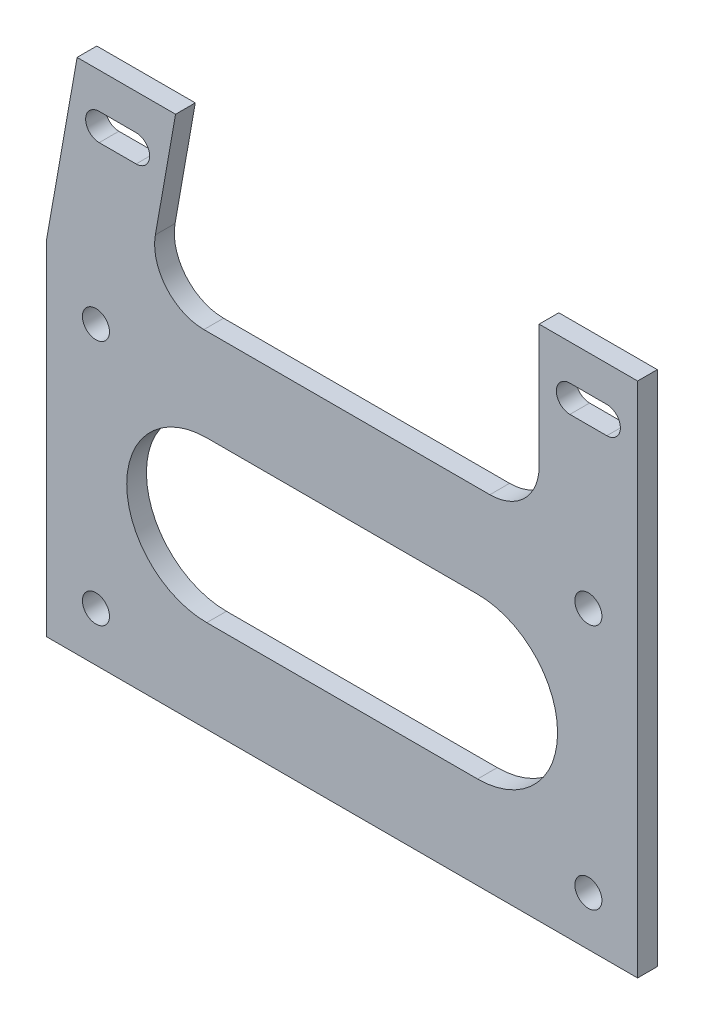
ISO-10303-21;
HEADER;
FILE_DESCRIPTION(('STEP AP214'),'2;1');
FILE_NAME('part.step','',(''),(''),'','','');
FILE_SCHEMA(('AUTOMOTIVE_DESIGN { 1 0 10303 214 1 1 1 1 }'));
ENDSEC;
DATA;
#1=APPLICATION_CONTEXT('core data for automotive mechanical design processes');
#2=APPLICATION_PROTOCOL_DEFINITION('international standard','automotive_design',2000,#1);
#3=PRODUCT_CONTEXT('',#1,'mechanical');
#4=PRODUCT('Part','Part','',(#3));
#5=PRODUCT_RELATED_PRODUCT_CATEGORY('part','',(#4));
#6=PRODUCT_DEFINITION_FORMATION('','',#4);
#7=PRODUCT_DEFINITION_CONTEXT('part definition',#1,'design');
#8=PRODUCT_DEFINITION('design','',#6,#7);
#9=PRODUCT_DEFINITION_SHAPE('','',#8);
#10=(LENGTH_UNIT() NAMED_UNIT(*) SI_UNIT(.MILLI.,.METRE.));
#11=(NAMED_UNIT(*) PLANE_ANGLE_UNIT() SI_UNIT($,.RADIAN.));
#12=(NAMED_UNIT(*) SI_UNIT($,.STERADIAN.) SOLID_ANGLE_UNIT());
#13=UNCERTAINTY_MEASURE_WITH_UNIT(LENGTH_MEASURE(1.E-05),#10,'distance_accuracy_value','');
#14=(GEOMETRIC_REPRESENTATION_CONTEXT(3) GLOBAL_UNCERTAINTY_ASSIGNED_CONTEXT((#13)) GLOBAL_UNIT_ASSIGNED_CONTEXT((#10,
#11,#12)) REPRESENTATION_CONTEXT('',''));
#15=CARTESIAN_POINT('',(0.,0.,0.));
#16=DIRECTION('',(0.,0.,1.));
#17=DIRECTION('',(1.,0.,0.));
#18=AXIS2_PLACEMENT_3D('',#15,#16,#17);
#19=CARTESIAN_POINT('',(40.,0.,4.));
#20=DIRECTION('',(-1.,0.,0.));
#21=DIRECTION('',(0.,0.,1.));
#22=AXIS2_PLACEMENT_3D('',#19,#20,#21);
#23=PLANE('',#22);
#24=DIRECTION('',(0.,1.,0.));
#25=VECTOR('',#24,1.);
#26=CARTESIAN_POINT('',(40.,0.,0.));
#27=LINE('',#26,#25);
#28=CARTESIAN_POINT('',(40.,45.0000000000001,0.));
#29=VERTEX_POINT('',#28);
#30=CARTESIAN_POINT('',(40.,70.,0.));
#31=VERTEX_POINT('',#30);
#32=EDGE_CURVE('E313',#29,#31,#27,.T.);
#33=ORIENTED_EDGE('',*,*,#32,.F.);
#34=DIRECTION('',(0.,0.,-1.));
#35=VECTOR('',#34,1.);
#36=CARTESIAN_POINT('',(40.,45.0000000000001,4.));
#37=LINE('',#36,#35);
#38=CARTESIAN_POINT('',(40.,45.0000000000001,4.));
#39=VERTEX_POINT('',#38);
#40=EDGE_CURVE('E11',#39,#29,#37,.T.);
#41=ORIENTED_EDGE('',*,*,#40,.F.);
#42=DIRECTION('',(0.,1.,0.));
#43=VECTOR('',#42,1.);
#44=CARTESIAN_POINT('',(40.,0.,4.));
#45=LINE('',#44,#43);
#46=CARTESIAN_POINT('',(40.,70.,4.));
#47=VERTEX_POINT('',#46);
#48=EDGE_CURVE('E384',#39,#47,#45,.T.);
#49=ORIENTED_EDGE('',*,*,#48,.T.);
#50=DIRECTION('',(0.,0.,-1.));
#51=VECTOR('',#50,1.);
#52=CARTESIAN_POINT('',(40.,70.,4.));
#53=LINE('',#52,#51);
#54=EDGE_CURVE('E133',#47,#31,#53,.T.);
#55=ORIENTED_EDGE('',*,*,#54,.T.);
#56=EDGE_LOOP('',(#33,#41,#49,#55));
#57=FACE_BOUND('',#56,.T.);
#58=ADVANCED_FACE('F35',(#57),#23,.T.);
#59=CARTESIAN_POINT('',(30.,45.,4.));
#60=DIRECTION('',(0.,0.,-1.));
#61=DIRECTION('',(-1.,0.,0.));
#62=AXIS2_PLACEMENT_3D('',#59,#60,#61);
#63=CYLINDRICAL_SURFACE('',#62,10.);
#64=CARTESIAN_POINT('',(30.,45.,0.));
#65=DIRECTION('',(0.,0.,1.));
#66=DIRECTION('',(1.,0.,0.));
#67=AXIS2_PLACEMENT_3D('',#64,#65,#66);
#68=CIRCLE('',#67,10.);
#69=CARTESIAN_POINT('',(29.9999999999999,35.,0.));
#70=VERTEX_POINT('',#69);
#71=EDGE_CURVE('E315',#29,#70,#68,.F.);
#72=ORIENTED_EDGE('',*,*,#71,.T.);
#73=DIRECTION('',(0.,0.,-1.));
#74=VECTOR('',#73,1.);
#75=CARTESIAN_POINT('',(29.9999999999999,35.,4.));
#76=LINE('',#75,#74);
#77=CARTESIAN_POINT('',(29.9999999999999,35.,4.));
#78=VERTEX_POINT('',#77);
#79=EDGE_CURVE('E45',#78,#70,#76,.T.);
#80=ORIENTED_EDGE('',*,*,#79,.F.);
#81=CARTESIAN_POINT('',(30.,45.,4.));
#82=DIRECTION('',(0.,0.,1.));
#83=DIRECTION('',(1.,0.,0.));
#84=AXIS2_PLACEMENT_3D('',#81,#82,#83);
#85=CIRCLE('',#84,10.);
#86=EDGE_CURVE('E386',#39,#78,#85,.F.);
#87=ORIENTED_EDGE('',*,*,#86,.F.);
#88=ORIENTED_EDGE('',*,*,#40,.T.);
#89=EDGE_LOOP('',(#72,#80,#87,#88));
#90=FACE_BOUND('',#89,.T.);
#91=ADVANCED_FACE('F434',(#90),#63,.F.);
#92=CARTESIAN_POINT('',(0.,35.,4.));
#93=DIRECTION('',(0.,1.,0.));
#94=DIRECTION('',(0.,0.,1.));
#95=AXIS2_PLACEMENT_3D('',#92,#93,#94);
#96=PLANE('',#95);
#97=DIRECTION('',(1.,0.,0.));
#98=VECTOR('',#97,1.);
#99=CARTESIAN_POINT('',(0.,35.,0.));
#100=LINE('',#99,#98);
#101=CARTESIAN_POINT('',(-28.0824640740578,35.,0.));
#102=VERTEX_POINT('',#101);
#103=EDGE_CURVE('E318',#102,#70,#100,.T.);
#104=ORIENTED_EDGE('',*,*,#103,.F.);
#105=DIRECTION('',(0.,0.,-1.));
#106=VECTOR('',#105,1.);
#107=CARTESIAN_POINT('',(-28.0824640740578,35.,4.));
#108=LINE('',#107,#106);
#109=CARTESIAN_POINT('',(-28.0824640740578,35.,4.));
#110=VERTEX_POINT('',#109);
#111=EDGE_CURVE('E236',#110,#102,#108,.T.);
#112=ORIENTED_EDGE('',*,*,#111,.F.);
#113=DIRECTION('',(1.,0.,0.));
#114=VECTOR('',#113,1.);
#115=CARTESIAN_POINT('',(0.,35.,4.));
#116=LINE('',#115,#114);
#117=EDGE_CURVE('E388',#110,#78,#116,.T.);
#118=ORIENTED_EDGE('',*,*,#117,.T.);
#119=ORIENTED_EDGE('',*,*,#79,.T.);
#120=EDGE_LOOP('',(#104,#112,#118,#119));
#121=FACE_BOUND('',#120,.T.);
#122=ADVANCED_FACE('F439',(#121),#96,.T.);
#123=CARTESIAN_POINT('',(-28.0824640740579,45.,4.));
#124=DIRECTION('',(0.,0.,-1.));
#125=DIRECTION('',(-1.,0.,0.));
#126=AXIS2_PLACEMENT_3D('',#123,#124,#125);
#127=CYLINDRICAL_SURFACE('',#126,10.);
#128=CARTESIAN_POINT('',(-28.0824640740579,45.,0.));
#129=DIRECTION('',(0.,0.,1.));
#130=DIRECTION('',(1.,0.,0.));
#131=AXIS2_PLACEMENT_3D('',#128,#129,#130);
#132=CIRCLE('',#131,10.);
#133=CARTESIAN_POINT('',(-37.93054160418,46.7364817766694,0.));
#134=VERTEX_POINT('',#133);
#135=EDGE_CURVE('E321',#102,#134,#132,.F.);
#136=ORIENTED_EDGE('',*,*,#135,.T.);
#137=DIRECTION('',(0.,0.,-1.));
#138=VECTOR('',#137,1.);
#139=CARTESIAN_POINT('',(-37.93054160418,46.7364817766694,4.));
#140=LINE('',#139,#138);
#141=CARTESIAN_POINT('',(-37.93054160418,46.7364817766694,4.));
#142=VERTEX_POINT('',#141);
#143=EDGE_CURVE('E234',#142,#134,#140,.T.);
#144=ORIENTED_EDGE('',*,*,#143,.F.);
#145=CARTESIAN_POINT('',(-28.0824640740579,45.,4.));
#146=DIRECTION('',(0.,0.,1.));
#147=DIRECTION('',(1.,0.,0.));
#148=AXIS2_PLACEMENT_3D('',#145,#146,#147);
#149=CIRCLE('',#148,10.);
#150=EDGE_CURVE('E391',#110,#142,#149,.F.);
#151=ORIENTED_EDGE('',*,*,#150,.F.);
#152=ORIENTED_EDGE('',*,*,#111,.T.);
#153=EDGE_LOOP('',(#136,#144,#151,#152));
#154=FACE_BOUND('',#153,.T.);
#155=ADVANCED_FACE('F589',(#154),#127,.F.);
#156=CARTESIAN_POINT('',(-44.7792049239173,7.89578200275982,4.));
#157=DIRECTION('',(0.984807753012209,-0.173648177666927,0.));
#158=DIRECTION('',(0.173648177666927,0.984807753012209,0.));
#159=AXIS2_PLACEMENT_3D('',#156,#157,#158);
#160=PLANE('',#159);
#161=DIRECTION('',(-0.173648177666927,-0.984807753012209,0.));
#162=VECTOR('',#161,1.);
#163=CARTESIAN_POINT('',(-44.7792049239173,7.89578200275982,0.));
#164=LINE('',#163,#162);
#165=CARTESIAN_POINT('',(-33.8285556752038,70.,0.));
#166=VERTEX_POINT('',#165);
#167=EDGE_CURVE('E324',#166,#134,#164,.T.);
#168=ORIENTED_EDGE('',*,*,#167,.F.);
#169=DIRECTION('',(0.,0.,-1.));
#170=VECTOR('',#169,1.);
#171=CARTESIAN_POINT('',(-33.8285556752038,70.,4.));
#172=LINE('',#171,#170);
#173=CARTESIAN_POINT('',(-33.8285556752038,70.,4.));
#174=VERTEX_POINT('',#173);
#175=EDGE_CURVE('E232',#174,#166,#172,.T.);
#176=ORIENTED_EDGE('',*,*,#175,.F.);
#177=DIRECTION('',(-0.173648177666927,-0.984807753012209,0.));
#178=VECTOR('',#177,1.);
#179=CARTESIAN_POINT('',(-44.7792049239173,7.89578200275982,4.));
#180=LINE('',#179,#178);
#181=EDGE_CURVE('E393',#174,#142,#180,.T.);
#182=ORIENTED_EDGE('',*,*,#181,.T.);
#183=ORIENTED_EDGE('',*,*,#143,.T.);
#184=EDGE_LOOP('',(#168,#176,#182,#183));
#185=FACE_BOUND('',#184,.T.);
#186=ADVANCED_FACE('F585',(#185),#160,.T.);
#187=CARTESIAN_POINT('',(0.,70.,4.));
#188=DIRECTION('',(0.,1.,0.));
#189=DIRECTION('',(0.,0.,1.));
#190=AXIS2_PLACEMENT_3D('',#187,#188,#189);
#191=PLANE('',#190);
#192=DIRECTION('',(1.,0.,0.));
#193=VECTOR('',#192,1.);
#194=CARTESIAN_POINT('',(0.,70.,0.));
#195=LINE('',#194,#193);
#196=CARTESIAN_POINT('',(-53.8285556752038,70.,0.));
#197=VERTEX_POINT('',#196);
#198=EDGE_CURVE('E327',#197,#166,#195,.T.);
#199=ORIENTED_EDGE('',*,*,#198,.F.);
#200=DIRECTION('',(0.,0.,-1.));
#201=VECTOR('',#200,1.);
#202=CARTESIAN_POINT('',(-53.8285556752038,70.,4.));
#203=LINE('',#202,#201);
#204=CARTESIAN_POINT('',(-53.8285556752038,70.,4.));
#205=VERTEX_POINT('',#204);
#206=EDGE_CURVE('E230',#205,#197,#203,.T.);
#207=ORIENTED_EDGE('',*,*,#206,.F.);
#208=DIRECTION('',(1.,0.,0.));
#209=VECTOR('',#208,1.);
#210=CARTESIAN_POINT('',(0.,70.,4.));
#211=LINE('',#210,#209);
#212=EDGE_CURVE('E396',#205,#174,#211,.T.);
#213=ORIENTED_EDGE('',*,*,#212,.T.);
#214=ORIENTED_EDGE('',*,*,#175,.T.);
#215=EDGE_LOOP('',(#199,#207,#213,#214));
#216=FACE_BOUND('',#215,.T.);
#217=ADVANCED_FACE('F581',(#216),#191,.T.);
#218=CARTESIAN_POINT('',(-64.1761311317764,11.3159834360165,4.));
#219=DIRECTION('',(-0.984807753012209,0.173648177666927,0.));
#220=DIRECTION('',(-0.173648177666927,-0.984807753012209,0.));
#221=AXIS2_PLACEMENT_3D('',#218,#219,#220);
#222=PLANE('',#221);
#223=DIRECTION('',(0.173648177666927,0.984807753012209,0.));
#224=VECTOR('',#223,1.);
#225=CARTESIAN_POINT('',(-64.1761311317764,11.3159834360165,0.));
#226=LINE('',#225,#224);
#227=CARTESIAN_POINT('',(-60.,35.,0.));
#228=VERTEX_POINT('',#227);
#229=EDGE_CURVE('E330',#228,#197,#226,.T.);
#230=ORIENTED_EDGE('',*,*,#229,.F.);
#231=DIRECTION('',(0.,0.,-1.));
#232=VECTOR('',#231,1.);
#233=CARTESIAN_POINT('',(-60.,35.,4.));
#234=LINE('',#233,#232);
#235=CARTESIAN_POINT('',(-60.,35.,4.));
#236=VERTEX_POINT('',#235);
#237=EDGE_CURVE('E224',#236,#228,#234,.T.);
#238=ORIENTED_EDGE('',*,*,#237,.F.);
#239=DIRECTION('',(0.173648177666927,0.984807753012209,0.));
#240=VECTOR('',#239,1.);
#241=CARTESIAN_POINT('',(-64.1761311317764,11.3159834360165,4.));
#242=LINE('',#241,#240);
#243=EDGE_CURVE('E399',#236,#205,#242,.T.);
#244=ORIENTED_EDGE('',*,*,#243,.T.);
#245=ORIENTED_EDGE('',*,*,#206,.T.);
#246=EDGE_LOOP('',(#230,#238,#244,#245));
#247=FACE_BOUND('',#246,.T.);
#248=ADVANCED_FACE('F577',(#247),#222,.T.);
#249=CARTESIAN_POINT('',(-60.,0.,4.));
#250=DIRECTION('',(-1.,0.,0.));
#251=DIRECTION('',(0.,0.,1.));
#252=AXIS2_PLACEMENT_3D('',#249,#250,#251);
#253=PLANE('',#252);
#254=DIRECTION('',(0.,1.,0.));
#255=VECTOR('',#254,1.);
#256=CARTESIAN_POINT('',(-60.,0.,0.));
#257=LINE('',#256,#255);
#258=CARTESIAN_POINT('',(-60.,-35.,0.));
#259=VERTEX_POINT('',#258);
#260=EDGE_CURVE('E333',#259,#228,#257,.T.);
#261=ORIENTED_EDGE('',*,*,#260,.F.);
#262=DIRECTION('',(0.,0.,-1.));
#263=VECTOR('',#262,1.);
#264=CARTESIAN_POINT('',(-60.,-35.,4.));
#265=LINE('',#264,#263);
#266=CARTESIAN_POINT('',(-60.,-35.,4.));
#267=VERTEX_POINT('',#266);
#268=EDGE_CURVE('E222',#267,#259,#265,.T.);
#269=ORIENTED_EDGE('',*,*,#268,.F.);
#270=DIRECTION('',(0.,1.,0.));
#271=VECTOR('',#270,1.);
#272=CARTESIAN_POINT('',(-60.,0.,4.));
#273=LINE('',#272,#271);
#274=EDGE_CURVE('E216',#267,#236,#273,.T.);
#275=ORIENTED_EDGE('',*,*,#274,.T.);
#276=ORIENTED_EDGE('',*,*,#237,.T.);
#277=EDGE_LOOP('',(#261,#269,#275,#276));
#278=FACE_BOUND('',#277,.T.);
#279=ADVANCED_FACE('F574',(#278),#253,.T.);
#280=CARTESIAN_POINT('',(0.,-35.,4.));
#281=DIRECTION('',(0.,1.,0.));
#282=DIRECTION('',(0.,0.,1.));
#283=AXIS2_PLACEMENT_3D('',#280,#281,#282);
#284=PLANE('',#283);
#285=DIRECTION('',(1.,0.,0.));
#286=VECTOR('',#285,1.);
#287=CARTESIAN_POINT('',(0.,-35.,0.));
#288=LINE('',#287,#286);
#289=CARTESIAN_POINT('',(60.,-35.,0.));
#290=VERTEX_POINT('',#289);
#291=EDGE_CURVE('E221',#259,#290,#288,.T.);
#292=ORIENTED_EDGE('',*,*,#291,.T.);
#293=DIRECTION('',(0.,0.,-1.));
#294=VECTOR('',#293,1.);
#295=CARTESIAN_POINT('',(60.,-35.,4.));
#296=LINE('',#295,#294);
#297=CARTESIAN_POINT('',(60.,-35.,4.));
#298=VERTEX_POINT('',#297);
#299=EDGE_CURVE('E206',#298,#290,#296,.T.);
#300=ORIENTED_EDGE('',*,*,#299,.F.);
#301=DIRECTION('',(1.,0.,0.));
#302=VECTOR('',#301,1.);
#303=CARTESIAN_POINT('',(0.,-35.,4.));
#304=LINE('',#303,#302);
#305=EDGE_CURVE('E209',#267,#298,#304,.T.);
#306=ORIENTED_EDGE('',*,*,#305,.F.);
#307=ORIENTED_EDGE('',*,*,#268,.T.);
#308=EDGE_LOOP('',(#292,#300,#306,#307));
#309=FACE_BOUND('',#308,.T.);
#310=ADVANCED_FACE('F219',(#309),#284,.F.);
#311=CARTESIAN_POINT('',(60.,0.,4.));
#312=DIRECTION('',(-1.,0.,0.));
#313=DIRECTION('',(0.,0.,1.));
#314=AXIS2_PLACEMENT_3D('',#311,#312,#313);
#315=PLANE('',#314);
#316=DIRECTION('',(0.,1.,0.));
#317=VECTOR('',#316,1.);
#318=CARTESIAN_POINT('',(60.,0.,0.));
#319=LINE('',#318,#317);
#320=CARTESIAN_POINT('',(60.,70.,0.));
#321=VERTEX_POINT('',#320);
#322=EDGE_CURVE('E337',#290,#321,#319,.T.);
#323=ORIENTED_EDGE('',*,*,#322,.T.);
#324=DIRECTION('',(0.,0.,-1.));
#325=VECTOR('',#324,1.);
#326=CARTESIAN_POINT('',(60.,70.,4.));
#327=LINE('',#326,#325);
#328=CARTESIAN_POINT('',(60.,70.,4.));
#329=VERTEX_POINT('',#328);
#330=EDGE_CURVE('E208',#329,#321,#327,.T.);
#331=ORIENTED_EDGE('',*,*,#330,.F.);
#332=DIRECTION('',(0.,1.,0.));
#333=VECTOR('',#332,1.);
#334=CARTESIAN_POINT('',(60.,0.,4.));
#335=LINE('',#334,#333);
#336=EDGE_CURVE('E201',#298,#329,#335,.T.);
#337=ORIENTED_EDGE('',*,*,#336,.F.);
#338=ORIENTED_EDGE('',*,*,#299,.T.);
#339=EDGE_LOOP('',(#323,#331,#337,#338));
#340=FACE_BOUND('',#339,.T.);
#341=ADVANCED_FACE('F204',(#340),#315,.F.);
#342=CARTESIAN_POINT('',(-27.5,0.,4.));
#343=DIRECTION('',(0.,0.,-1.));
#344=DIRECTION('',(-1.,0.,0.));
#345=AXIS2_PLACEMENT_3D('',#342,#343,#344);
#346=CYLINDRICAL_SURFACE('',#345,16.25);
#347=CARTESIAN_POINT('',(-27.5,0.,0.));
#348=DIRECTION('',(0.,0.,1.));
#349=DIRECTION('',(1.,0.,0.));
#350=AXIS2_PLACEMENT_3D('',#347,#348,#349);
#351=CIRCLE('',#350,16.25);
#352=CARTESIAN_POINT('',(-27.5,16.25,0.));
#353=VERTEX_POINT('',#352);
#354=CARTESIAN_POINT('',(-27.5,-16.25,0.));
#355=VERTEX_POINT('',#354);
#356=EDGE_CURVE('E301',#353,#355,#351,.T.);
#357=ORIENTED_EDGE('',*,*,#356,.F.);
#358=DIRECTION('',(0.,0.,-1.));
#359=VECTOR('',#358,1.);
#360=CARTESIAN_POINT('',(-27.5,16.25,4.));
#361=LINE('',#360,#359);
#362=CARTESIAN_POINT('',(-27.5,16.25,4.));
#363=VERTEX_POINT('',#362);
#364=EDGE_CURVE('E246',#363,#353,#361,.T.);
#365=ORIENTED_EDGE('',*,*,#364,.F.);
#366=CARTESIAN_POINT('',(-27.5,0.,4.));
#367=DIRECTION('',(0.,0.,1.));
#368=DIRECTION('',(1.,0.,0.));
#369=AXIS2_PLACEMENT_3D('',#366,#367,#368);
#370=CIRCLE('',#369,16.25);
#371=CARTESIAN_POINT('',(-27.5,-16.25,4.));
#372=VERTEX_POINT('',#371);
#373=EDGE_CURVE('E373',#363,#372,#370,.T.);
#374=ORIENTED_EDGE('',*,*,#373,.T.);
#375=DIRECTION('',(0.,0.,-1.));
#376=VECTOR('',#375,1.);
#377=CARTESIAN_POINT('',(-27.5,-16.25,4.));
#378=LINE('',#377,#376);
#379=EDGE_CURVE('E239',#372,#355,#378,.T.);
#380=ORIENTED_EDGE('',*,*,#379,.T.);
#381=EDGE_LOOP('',(#357,#365,#374,#380));
#382=FACE_BOUND('',#381,.T.);
#383=ADVANCED_FACE('F457',(#382),#346,.F.);
#384=CARTESIAN_POINT('',(0.,16.25,4.));
#385=DIRECTION('',(0.,1.,0.));
#386=DIRECTION('',(0.,0.,1.));
#387=AXIS2_PLACEMENT_3D('',#384,#385,#386);
#388=PLANE('',#387);
#389=DIRECTION('',(1.,0.,0.));
#390=VECTOR('',#389,1.);
#391=CARTESIAN_POINT('',(0.,16.25,0.));
#392=LINE('',#391,#390);
#393=CARTESIAN_POINT('',(27.5,16.25,0.));
#394=VERTEX_POINT('',#393);
#395=EDGE_CURVE('E304',#353,#394,#392,.T.);
#396=ORIENTED_EDGE('',*,*,#395,.T.);
#397=DIRECTION('',(0.,0.,-1.));
#398=VECTOR('',#397,1.);
#399=CARTESIAN_POINT('',(27.5,16.25,4.));
#400=LINE('',#399,#398);
#401=CARTESIAN_POINT('',(27.5,16.25,4.));
#402=VERTEX_POINT('',#401);
#403=EDGE_CURVE('E244',#402,#394,#400,.T.);
#404=ORIENTED_EDGE('',*,*,#403,.F.);
#405=DIRECTION('',(1.,0.,0.));
#406=VECTOR('',#405,1.);
#407=CARTESIAN_POINT('',(0.,16.25,4.));
#408=LINE('',#407,#406);
#409=EDGE_CURVE('E376',#363,#402,#408,.T.);
#410=ORIENTED_EDGE('',*,*,#409,.F.);
#411=ORIENTED_EDGE('',*,*,#364,.T.);
#412=EDGE_LOOP('',(#396,#404,#410,#411));
#413=FACE_BOUND('',#412,.T.);
#414=ADVANCED_FACE('F453',(#413),#388,.F.);
#415=CARTESIAN_POINT('',(27.5,0.,4.));
#416=DIRECTION('',(0.,0.,-1.));
#417=DIRECTION('',(-1.,0.,0.));
#418=AXIS2_PLACEMENT_3D('',#415,#416,#417);
#419=CYLINDRICAL_SURFACE('',#418,16.25);
#420=CARTESIAN_POINT('',(27.5,0.,0.));
#421=DIRECTION('',(0.,0.,1.));
#422=DIRECTION('',(1.,0.,0.));
#423=AXIS2_PLACEMENT_3D('',#420,#421,#422);
#424=CIRCLE('',#423,16.25);
#425=CARTESIAN_POINT('',(27.5,-16.25,0.));
#426=VERTEX_POINT('',#425);
#427=EDGE_CURVE('E307',#426,#394,#424,.T.);
#428=ORIENTED_EDGE('',*,*,#427,.F.);
#429=DIRECTION('',(0.,0.,-1.));
#430=VECTOR('',#429,1.);
#431=CARTESIAN_POINT('',(27.5,-16.25,4.));
#432=LINE('',#431,#430);
#433=CARTESIAN_POINT('',(27.5,-16.25,4.));
#434=VERTEX_POINT('',#433);
#435=EDGE_CURVE('E241',#434,#426,#432,.T.);
#436=ORIENTED_EDGE('',*,*,#435,.F.);
#437=CARTESIAN_POINT('',(27.5,0.,4.));
#438=DIRECTION('',(0.,0.,1.));
#439=DIRECTION('',(1.,0.,0.));
#440=AXIS2_PLACEMENT_3D('',#437,#438,#439);
#441=CIRCLE('',#440,16.25);
#442=EDGE_CURVE('E378',#434,#402,#441,.T.);
#443=ORIENTED_EDGE('',*,*,#442,.T.);
#444=ORIENTED_EDGE('',*,*,#403,.T.);
#445=EDGE_LOOP('',(#428,#436,#443,#444));
#446=FACE_BOUND('',#445,.T.);
#447=ADVANCED_FACE('F449',(#446),#419,.F.);
#448=CARTESIAN_POINT('',(53.75,60.,4.));
#449=DIRECTION('',(0.,0.,-1.));
#450=DIRECTION('',(-1.,0.,0.));
#451=AXIS2_PLACEMENT_3D('',#448,#449,#450);
#452=CYLINDRICAL_SURFACE('',#451,2.74999999999998);
#453=CARTESIAN_POINT('',(53.75,60.,0.));
#454=DIRECTION('',(0.,0.,1.));
#455=DIRECTION('',(1.,0.,0.));
#456=AXIS2_PLACEMENT_3D('',#453,#454,#455);
#457=CIRCLE('',#456,2.74999999999998);
#458=CARTESIAN_POINT('',(53.7499999999997,57.25,0.));
#459=VERTEX_POINT('',#458);
#460=CARTESIAN_POINT('',(53.75,62.75,0.));
#461=VERTEX_POINT('',#460);
#462=EDGE_CURVE('E289',#459,#461,#457,.T.);
#463=ORIENTED_EDGE('',*,*,#462,.F.);
#464=DIRECTION('',(0.,0.,-1.));
#465=VECTOR('',#464,1.);
#466=CARTESIAN_POINT('',(53.7499999999997,57.25,4.));
#467=LINE('',#466,#465);
#468=CARTESIAN_POINT('',(53.7499999999997,57.25,4.));
#469=VERTEX_POINT('',#468);
#470=EDGE_CURVE('E242',#469,#459,#467,.T.);
#471=ORIENTED_EDGE('',*,*,#470,.F.);
#472=CARTESIAN_POINT('',(53.75,60.,4.));
#473=DIRECTION('',(0.,0.,1.));
#474=DIRECTION('',(1.,0.,0.));
#475=AXIS2_PLACEMENT_3D('',#472,#473,#474);
#476=CIRCLE('',#475,2.74999999999998);
#477=CARTESIAN_POINT('',(53.75,62.75,4.));
#478=VERTEX_POINT('',#477);
#479=EDGE_CURVE('E362',#469,#478,#476,.T.);
#480=ORIENTED_EDGE('',*,*,#479,.T.);
#481=DIRECTION('',(0.,0.,-1.));
#482=VECTOR('',#481,1.);
#483=CARTESIAN_POINT('',(53.75,62.75,4.));
#484=LINE('',#483,#482);
#485=EDGE_CURVE('E248',#478,#461,#484,.T.);
#486=ORIENTED_EDGE('',*,*,#485,.T.);
#487=EDGE_LOOP('',(#463,#471,#480,#486));
#488=FACE_BOUND('',#487,.T.);
#489=ADVANCED_FACE('F452',(#488),#452,.F.);
#490=CARTESIAN_POINT('',(0.,57.25,4.));
#491=DIRECTION('',(0.,1.,0.));
#492=DIRECTION('',(0.,0.,1.));
#493=AXIS2_PLACEMENT_3D('',#490,#491,#492);
#494=PLANE('',#493);
#495=DIRECTION('',(1.,0.,0.));
#496=VECTOR('',#495,1.);
#497=CARTESIAN_POINT('',(0.,57.25,0.));
#498=LINE('',#497,#496);
#499=CARTESIAN_POINT('',(46.2499999999997,57.25,0.));
#500=VERTEX_POINT('',#499);
#501=EDGE_CURVE('E292',#500,#459,#498,.T.);
#502=ORIENTED_EDGE('',*,*,#501,.F.);
#503=DIRECTION('',(0.,0.,-1.));
#504=VECTOR('',#503,1.);
#505=CARTESIAN_POINT('',(46.2499999999997,57.25,4.));
#506=LINE('',#505,#504);
#507=CARTESIAN_POINT('',(46.2499999999997,57.25,4.));
#508=VERTEX_POINT('',#507);
#509=EDGE_CURVE('E252',#508,#500,#506,.T.);
#510=ORIENTED_EDGE('',*,*,#509,.F.);
#511=DIRECTION('',(1.,0.,0.));
#512=VECTOR('',#511,1.);
#513=CARTESIAN_POINT('',(0.,57.25,4.));
#514=LINE('',#513,#512);
#515=EDGE_CURVE('E365',#508,#469,#514,.T.);
#516=ORIENTED_EDGE('',*,*,#515,.T.);
#517=ORIENTED_EDGE('',*,*,#470,.T.);
#518=EDGE_LOOP('',(#502,#510,#516,#517));
#519=FACE_BOUND('',#518,.T.);
#520=ADVANCED_FACE('F468',(#519),#494,.T.);
#521=CARTESIAN_POINT('',(46.25,60.,4.));
#522=DIRECTION('',(0.,0.,-1.));
#523=DIRECTION('',(-1.,0.,0.));
#524=AXIS2_PLACEMENT_3D('',#521,#522,#523);
#525=CYLINDRICAL_SURFACE('',#524,2.74999999999998);
#526=CARTESIAN_POINT('',(46.25,60.,0.));
#527=DIRECTION('',(0.,0.,1.));
#528=DIRECTION('',(1.,0.,0.));
#529=AXIS2_PLACEMENT_3D('',#526,#527,#528);
#530=CIRCLE('',#529,2.74999999999998);
#531=CARTESIAN_POINT('',(46.25,62.75,0.));
#532=VERTEX_POINT('',#531);
#533=EDGE_CURVE('E295',#532,#500,#530,.T.);
#534=ORIENTED_EDGE('',*,*,#533,.F.);
#535=DIRECTION('',(0.,0.,-1.));
#536=VECTOR('',#535,1.);
#537=CARTESIAN_POINT('',(46.25,62.75,4.));
#538=LINE('',#537,#536);
#539=CARTESIAN_POINT('',(46.25,62.75,4.));
#540=VERTEX_POINT('',#539);
#541=EDGE_CURVE('E250',#540,#532,#538,.T.);
#542=ORIENTED_EDGE('',*,*,#541,.F.);
#543=CARTESIAN_POINT('',(46.25,60.,4.));
#544=DIRECTION('',(0.,0.,1.));
#545=DIRECTION('',(1.,0.,0.));
#546=AXIS2_PLACEMENT_3D('',#543,#544,#545);
#547=CIRCLE('',#546,2.74999999999998);
#548=EDGE_CURVE('E368',#540,#508,#547,.T.);
#549=ORIENTED_EDGE('',*,*,#548,.T.);
#550=ORIENTED_EDGE('',*,*,#509,.T.);
#551=EDGE_LOOP('',(#534,#542,#549,#550));
#552=FACE_BOUND('',#551,.T.);
#553=ADVANCED_FACE('F465',(#552),#525,.F.);
#554=CARTESIAN_POINT('',(-41.8418254822884,60.,4.));
#555=DIRECTION('',(0.,0.,-1.));
#556=DIRECTION('',(-1.,0.,0.));
#557=AXIS2_PLACEMENT_3D('',#554,#555,#556);
#558=CYLINDRICAL_SURFACE('',#557,2.75);
#559=CARTESIAN_POINT('',(-41.8418254822884,60.,0.));
#560=DIRECTION('',(0.,0.,1.));
#561=DIRECTION('',(1.,0.,0.));
#562=AXIS2_PLACEMENT_3D('',#559,#560,#561);
#563=CIRCLE('',#562,2.75);
#564=CARTESIAN_POINT('',(-41.8418254822884,57.25,0.));
#565=VERTEX_POINT('',#564);
#566=CARTESIAN_POINT('',(-41.8418254822884,62.75,0.));
#567=VERTEX_POINT('',#566);
#568=EDGE_CURVE('E272',#565,#567,#563,.T.);
#569=ORIENTED_EDGE('',*,*,#568,.F.);
#570=DIRECTION('',(0.,0.,-1.));
#571=VECTOR('',#570,1.);
#572=CARTESIAN_POINT('',(-41.8418254822884,57.25,4.));
#573=LINE('',#572,#571);
#574=CARTESIAN_POINT('',(-41.8418254822884,57.25,4.));
#575=VERTEX_POINT('',#574);
#576=EDGE_CURVE('E39',#575,#565,#573,.T.);
#577=ORIENTED_EDGE('',*,*,#576,.F.);
#578=CARTESIAN_POINT('',(-41.8418254822884,60.,4.));
#579=DIRECTION('',(0.,0.,1.));
#580=DIRECTION('',(1.,0.,0.));
#581=AXIS2_PLACEMENT_3D('',#578,#579,#580);
#582=CIRCLE('',#581,2.75);
#583=CARTESIAN_POINT('',(-41.8418254822884,62.75,4.));
#584=VERTEX_POINT('',#583);
#585=EDGE_CURVE('E355',#575,#584,#582,.T.);
#586=ORIENTED_EDGE('',*,*,#585,.T.);
#587=DIRECTION('',(0.,0.,-1.));
#588=VECTOR('',#587,1.);
#589=CARTESIAN_POINT('',(-41.8418254822884,62.75,4.));
#590=LINE('',#589,#588);
#591=EDGE_CURVE('E255',#584,#567,#590,.T.);
#592=ORIENTED_EDGE('',*,*,#591,.T.);
#593=EDGE_LOOP('',(#569,#577,#586,#592));
#594=FACE_BOUND('',#593,.T.);
#595=ADVANCED_FACE('F273',(#594),#558,.F.);
#596=CARTESIAN_POINT('',(0.,57.25,4.));
#597=DIRECTION('',(0.,1.,0.));
#598=DIRECTION('',(0.,0.,1.));
#599=AXIS2_PLACEMENT_3D('',#596,#597,#598);
#600=PLANE('',#599);
#601=DIRECTION('',(1.,0.,0.));
#602=VECTOR('',#601,1.);
#603=CARTESIAN_POINT('',(0.,57.25,0.));
#604=LINE('',#603,#602);
#605=CARTESIAN_POINT('',(-49.3418254822885,57.25,0.));
#606=VERTEX_POINT('',#605);
#607=EDGE_CURVE('E267',#606,#565,#604,.T.);
#608=ORIENTED_EDGE('',*,*,#607,.F.);
#609=DIRECTION('',(0.,0.,-1.));
#610=VECTOR('',#609,1.);
#611=CARTESIAN_POINT('',(-49.3418254822885,57.25,4.));
#612=LINE('',#611,#610);
#613=CARTESIAN_POINT('',(-49.3418254822885,57.25,4.));
#614=VERTEX_POINT('',#613);
#615=EDGE_CURVE('E258',#614,#606,#612,.T.);
#616=ORIENTED_EDGE('',*,*,#615,.F.);
#617=DIRECTION('',(1.,0.,0.));
#618=VECTOR('',#617,1.);
#619=CARTESIAN_POINT('',(0.,57.25,4.));
#620=LINE('',#619,#618);
#621=EDGE_CURVE('E270',#614,#575,#620,.T.);
#622=ORIENTED_EDGE('',*,*,#621,.T.);
#623=ORIENTED_EDGE('',*,*,#576,.T.);
#624=EDGE_LOOP('',(#608,#616,#622,#623));
#625=FACE_BOUND('',#624,.T.);
#626=ADVANCED_FACE('F265',(#625),#600,.T.);
#627=CARTESIAN_POINT('',(-49.3418254822884,60.,4.));
#628=DIRECTION('',(0.,0.,-1.));
#629=DIRECTION('',(-1.,0.,0.));
#630=AXIS2_PLACEMENT_3D('',#627,#628,#629);
#631=CYLINDRICAL_SURFACE('',#630,2.75);
#632=CARTESIAN_POINT('',(-49.3418254822884,60.,0.));
#633=DIRECTION('',(0.,0.,1.));
#634=DIRECTION('',(1.,0.,0.));
#635=AXIS2_PLACEMENT_3D('',#632,#633,#634);
#636=CIRCLE('',#635,2.75);
#637=CARTESIAN_POINT('',(-49.3418254822884,62.75,0.));
#638=VERTEX_POINT('',#637);
#639=EDGE_CURVE('E282',#638,#606,#636,.T.);
#640=ORIENTED_EDGE('',*,*,#639,.F.);
#641=DIRECTION('',(0.,0.,-1.));
#642=VECTOR('',#641,1.);
#643=CARTESIAN_POINT('',(-49.3418254822884,62.75,4.));
#644=LINE('',#643,#642);
#645=CARTESIAN_POINT('',(-49.3418254822884,62.75,4.));
#646=VERTEX_POINT('',#645);
#647=EDGE_CURVE('E257',#646,#638,#644,.T.);
#648=ORIENTED_EDGE('',*,*,#647,.F.);
#649=CARTESIAN_POINT('',(-49.3418254822884,60.,4.));
#650=DIRECTION('',(0.,0.,1.));
#651=DIRECTION('',(1.,0.,0.));
#652=AXIS2_PLACEMENT_3D('',#649,#650,#651);
#653=CIRCLE('',#652,2.75);
#654=EDGE_CURVE('E358',#646,#614,#653,.T.);
#655=ORIENTED_EDGE('',*,*,#654,.T.);
#656=ORIENTED_EDGE('',*,*,#615,.T.);
#657=EDGE_LOOP('',(#640,#648,#655,#656));
#658=FACE_BOUND('',#657,.T.);
#659=ADVANCED_FACE('F447',(#658),#631,.F.);
#660=CARTESIAN_POINT('',(0.,-16.25,4.));
#661=DIRECTION('',(0.,1.,0.));
#662=DIRECTION('',(0.,0.,1.));
#663=AXIS2_PLACEMENT_3D('',#660,#661,#662);
#664=PLANE('',#663);
#665=DIRECTION('',(1.,0.,0.));
#666=VECTOR('',#665,1.);
#667=CARTESIAN_POINT('',(0.,-16.25,0.));
#668=LINE('',#667,#666);
#669=EDGE_CURVE('E310',#355,#426,#668,.T.);
#670=ORIENTED_EDGE('',*,*,#669,.F.);
#671=ORIENTED_EDGE('',*,*,#379,.F.);
#672=DIRECTION('',(1.,0.,0.));
#673=VECTOR('',#672,1.);
#674=CARTESIAN_POINT('',(0.,-16.25,4.));
#675=LINE('',#674,#673);
#676=EDGE_CURVE('E381',#372,#434,#675,.T.);
#677=ORIENTED_EDGE('',*,*,#676,.T.);
#678=ORIENTED_EDGE('',*,*,#435,.T.);
#679=EDGE_LOOP('',(#670,#671,#677,#678));
#680=FACE_BOUND('',#679,.T.);
#681=ADVANCED_FACE('F444',(#680),#664,.T.);
#682=CARTESIAN_POINT('',(0.,62.75,4.));
#683=DIRECTION('',(0.,1.,0.));
#684=DIRECTION('',(0.,0.,1.));
#685=AXIS2_PLACEMENT_3D('',#682,#683,#684);
#686=PLANE('',#685);
#687=DIRECTION('',(1.,0.,0.));
#688=VECTOR('',#687,1.);
#689=CARTESIAN_POINT('',(0.,62.75,0.));
#690=LINE('',#689,#688);
#691=EDGE_CURVE('E298',#532,#461,#690,.T.);
#692=ORIENTED_EDGE('',*,*,#691,.T.);
#693=ORIENTED_EDGE('',*,*,#485,.F.);
#694=DIRECTION('',(1.,0.,0.));
#695=VECTOR('',#694,1.);
#696=CARTESIAN_POINT('',(0.,62.75,4.));
#697=LINE('',#696,#695);
#698=EDGE_CURVE('E371',#540,#478,#697,.T.);
#699=ORIENTED_EDGE('',*,*,#698,.F.);
#700=ORIENTED_EDGE('',*,*,#541,.T.);
#701=EDGE_LOOP('',(#692,#693,#699,#700));
#702=FACE_BOUND('',#701,.T.);
#703=ADVANCED_FACE('F429',(#702),#686,.F.);
#704=CARTESIAN_POINT('',(0.,62.75,4.));
#705=DIRECTION('',(0.,1.,0.));
#706=DIRECTION('',(0.,0.,1.));
#707=AXIS2_PLACEMENT_3D('',#704,#705,#706);
#708=PLANE('',#707);
#709=DIRECTION('',(1.,0.,0.));
#710=VECTOR('',#709,1.);
#711=CARTESIAN_POINT('',(0.,62.75,0.));
#712=LINE('',#711,#710);
#713=EDGE_CURVE('E284',#638,#567,#712,.T.);
#714=ORIENTED_EDGE('',*,*,#713,.T.);
#715=ORIENTED_EDGE('',*,*,#591,.F.);
#716=DIRECTION('',(1.,0.,0.));
#717=VECTOR('',#716,1.);
#718=CARTESIAN_POINT('',(0.,62.75,4.));
#719=LINE('',#718,#717);
#720=EDGE_CURVE('E360',#646,#584,#719,.T.);
#721=ORIENTED_EDGE('',*,*,#720,.F.);
#722=ORIENTED_EDGE('',*,*,#647,.T.);
#723=EDGE_LOOP('',(#714,#715,#721,#722));
#724=FACE_BOUND('',#723,.T.);
#725=ADVANCED_FACE('F419',(#724),#708,.F.);
#726=CARTESIAN_POINT('',(50.,-25.,4.));
#727=DIRECTION('',(0.,0.,-1.));
#728=DIRECTION('',(-1.,0.,0.));
#729=AXIS2_PLACEMENT_3D('',#726,#727,#728);
#730=CYLINDRICAL_SURFACE('',#729,2.75);
#731=CARTESIAN_POINT('',(50.,-25.,4.));
#732=DIRECTION('',(0.,0.,1.));
#733=DIRECTION('',(1.,0.,0.));
#734=AXIS2_PLACEMENT_3D('',#731,#732,#733);
#735=CIRCLE('',#734,2.75);
#736=CARTESIAN_POINT('',(52.75,-25.,4.));
#737=VERTEX_POINT('',#736);
#738=EDGE_CURVE('E352',#737,#737,#735,.T.);
#739=ORIENTED_EDGE('',*,*,#738,.T.);
#740=EDGE_LOOP('',(#739));
#741=FACE_BOUND('',#740,.T.);
#742=CARTESIAN_POINT('',(50.,-25.,0.));
#743=DIRECTION('',(0.,0.,1.));
#744=DIRECTION('',(1.,0.,0.));
#745=AXIS2_PLACEMENT_3D('',#742,#743,#744);
#746=CIRCLE('',#745,2.75);
#747=CARTESIAN_POINT('',(52.75,-25.,0.));
#748=VERTEX_POINT('',#747);
#749=EDGE_CURVE('E278',#748,#748,#746,.T.);
#750=ORIENTED_EDGE('',*,*,#749,.F.);
#751=EDGE_LOOP('',(#750));
#752=FACE_BOUND('',#751,.T.);
#753=ADVANCED_FACE('F416',(#741,#752),#730,.F.);
#754=CARTESIAN_POINT('',(50.,25.,4.));
#755=DIRECTION('',(0.,0.,-1.));
#756=DIRECTION('',(-1.,0.,0.));
#757=AXIS2_PLACEMENT_3D('',#754,#755,#756);
#758=CYLINDRICAL_SURFACE('',#757,2.74999999999999);
#759=CARTESIAN_POINT('',(50.,25.,4.));
#760=DIRECTION('',(0.,0.,1.));
#761=DIRECTION('',(1.,0.,0.));
#762=AXIS2_PLACEMENT_3D('',#759,#760,#761);
#763=CIRCLE('',#762,2.74999999999999);
#764=CARTESIAN_POINT('',(52.75,25.,4.));
#765=VERTEX_POINT('',#764);
#766=EDGE_CURVE('E347',#765,#765,#763,.T.);
#767=ORIENTED_EDGE('',*,*,#766,.T.);
#768=EDGE_LOOP('',(#767));
#769=FACE_BOUND('',#768,.T.);
#770=CARTESIAN_POINT('',(50.,25.,0.));
#771=DIRECTION('',(0.,0.,1.));
#772=DIRECTION('',(1.,0.,0.));
#773=AXIS2_PLACEMENT_3D('',#770,#771,#772);
#774=CIRCLE('',#773,2.74999999999999);
#775=CARTESIAN_POINT('',(52.75,25.,0.));
#776=VERTEX_POINT('',#775);
#777=EDGE_CURVE('E410',#776,#776,#774,.T.);
#778=ORIENTED_EDGE('',*,*,#777,.F.);
#779=EDGE_LOOP('',(#778));
#780=FACE_BOUND('',#779,.T.);
#781=ADVANCED_FACE('F418',(#769,#780),#758,.F.);
#782=CARTESIAN_POINT('',(-50.,-25.,4.));
#783=DIRECTION('',(0.,0.,-1.));
#784=DIRECTION('',(-1.,0.,0.));
#785=AXIS2_PLACEMENT_3D('',#782,#783,#784);
#786=CYLINDRICAL_SURFACE('',#785,2.75);
#787=CARTESIAN_POINT('',(-50.,-25.,4.));
#788=DIRECTION('',(0.,0.,1.));
#789=DIRECTION('',(1.,0.,0.));
#790=AXIS2_PLACEMENT_3D('',#787,#788,#789);
#791=CIRCLE('',#790,2.75);
#792=CARTESIAN_POINT('',(-47.25,-25.,4.));
#793=VERTEX_POINT('',#792);
#794=EDGE_CURVE('E342',#793,#793,#791,.T.);
#795=ORIENTED_EDGE('',*,*,#794,.T.);
#796=EDGE_LOOP('',(#795));
#797=FACE_BOUND('',#796,.T.);
#798=CARTESIAN_POINT('',(-50.,-25.,0.));
#799=DIRECTION('',(0.,0.,1.));
#800=DIRECTION('',(1.,0.,0.));
#801=AXIS2_PLACEMENT_3D('',#798,#799,#800);
#802=CIRCLE('',#801,2.75);
#803=CARTESIAN_POINT('',(-47.25,-25.,0.));
#804=VERTEX_POINT('',#803);
#805=EDGE_CURVE('E407',#804,#804,#802,.T.);
#806=ORIENTED_EDGE('',*,*,#805,.F.);
#807=EDGE_LOOP('',(#806));
#808=FACE_BOUND('',#807,.T.);
#809=ADVANCED_FACE('F426',(#797,#808),#786,.F.);
#810=CARTESIAN_POINT('',(-50.,25.,4.));
#811=DIRECTION('',(0.,0.,-1.));
#812=DIRECTION('',(-1.,0.,0.));
#813=AXIS2_PLACEMENT_3D('',#810,#811,#812);
#814=CYLINDRICAL_SURFACE('',#813,2.75);
#815=CARTESIAN_POINT('',(-50.,25.,4.));
#816=DIRECTION('',(0.,0.,1.));
#817=DIRECTION('',(1.,0.,0.));
#818=AXIS2_PLACEMENT_3D('',#815,#816,#817);
#819=CIRCLE('',#818,2.75);
#820=CARTESIAN_POINT('',(-47.25,25.,4.));
#821=VERTEX_POINT('',#820);
#822=EDGE_CURVE('E339',#821,#821,#819,.T.);
#823=ORIENTED_EDGE('',*,*,#822,.T.);
#824=EDGE_LOOP('',(#823));
#825=FACE_BOUND('',#824,.T.);
#826=CARTESIAN_POINT('',(-50.,25.,0.));
#827=DIRECTION('',(0.,0.,1.));
#828=DIRECTION('',(1.,0.,0.));
#829=AXIS2_PLACEMENT_3D('',#826,#827,#828);
#830=CIRCLE('',#829,2.75);
#831=CARTESIAN_POINT('',(-47.25,25.,0.));
#832=VERTEX_POINT('',#831);
#833=EDGE_CURVE('E404',#832,#832,#830,.T.);
#834=ORIENTED_EDGE('',*,*,#833,.F.);
#835=EDGE_LOOP('',(#834));
#836=FACE_BOUND('',#835,.T.);
#837=ADVANCED_FACE('F37',(#825,#836),#814,.F.);
#838=CARTESIAN_POINT('',(1.45716771982052E-13,70.0000000000001,4.));
#839=DIRECTION('',(0.,-1.,0.));
#840=DIRECTION('',(1.,0.,0.));
#841=AXIS2_PLACEMENT_3D('',#838,#839,#840);
#842=PLANE('',#841);
#843=DIRECTION('',(-1.,0.,0.));
#844=VECTOR('',#843,1.);
#845=CARTESIAN_POINT('',(1.45716771982052E-13,70.0000000000001,0.));
#846=LINE('',#845,#844);
#847=EDGE_CURVE('E126',#321,#31,#846,.T.);
#848=ORIENTED_EDGE('',*,*,#847,.T.);
#849=ORIENTED_EDGE('',*,*,#54,.F.);
#850=DIRECTION('',(-1.,0.,0.));
#851=VECTOR('',#850,1.);
#852=CARTESIAN_POINT('',(1.45716771982052E-13,70.0000000000001,4.));
#853=LINE('',#852,#851);
#854=EDGE_CURVE('E54',#329,#47,#853,.T.);
#855=ORIENTED_EDGE('',*,*,#854,.F.);
#856=ORIENTED_EDGE('',*,*,#330,.T.);
#857=EDGE_LOOP('',(#848,#849,#855,#856));
#858=FACE_BOUND('',#857,.T.);
#859=ADVANCED_FACE('F531',(#858),#842,.F.);
#860=CARTESIAN_POINT('',(0.,0.,4.));
#861=DIRECTION('',(0.,0.,1.));
#862=DIRECTION('',(1.,0.,0.));
#863=AXIS2_PLACEMENT_3D('',#860,#861,#862);
#864=PLANE('',#863);
#865=ORIENTED_EDGE('',*,*,#822,.F.);
#866=EDGE_LOOP('',(#865));
#867=FACE_BOUND('',#866,.T.);
#868=ORIENTED_EDGE('',*,*,#794,.F.);
#869=EDGE_LOOP('',(#868));
#870=FACE_BOUND('',#869,.T.);
#871=ORIENTED_EDGE('',*,*,#766,.F.);
#872=EDGE_LOOP('',(#871));
#873=FACE_BOUND('',#872,.T.);
#874=ORIENTED_EDGE('',*,*,#738,.F.);
#875=EDGE_LOOP('',(#874));
#876=FACE_BOUND('',#875,.T.);
#877=ORIENTED_EDGE('',*,*,#585,.F.);
#878=ORIENTED_EDGE('',*,*,#621,.F.);
#879=ORIENTED_EDGE('',*,*,#654,.F.);
#880=ORIENTED_EDGE('',*,*,#720,.T.);
#881=EDGE_LOOP('',(#877,#878,#879,#880));
#882=FACE_BOUND('',#881,.T.);
#883=ORIENTED_EDGE('',*,*,#479,.F.);
#884=ORIENTED_EDGE('',*,*,#515,.F.);
#885=ORIENTED_EDGE('',*,*,#548,.F.);
#886=ORIENTED_EDGE('',*,*,#698,.T.);
#887=EDGE_LOOP('',(#883,#884,#885,#886));
#888=FACE_BOUND('',#887,.T.);
#889=ORIENTED_EDGE('',*,*,#373,.F.);
#890=ORIENTED_EDGE('',*,*,#409,.T.);
#891=ORIENTED_EDGE('',*,*,#442,.F.);
#892=ORIENTED_EDGE('',*,*,#676,.F.);
#893=EDGE_LOOP('',(#889,#890,#891,#892));
#894=FACE_BOUND('',#893,.T.);
#895=ORIENTED_EDGE('',*,*,#48,.F.);
#896=ORIENTED_EDGE('',*,*,#86,.T.);
#897=ORIENTED_EDGE('',*,*,#117,.F.);
#898=ORIENTED_EDGE('',*,*,#150,.T.);
#899=ORIENTED_EDGE('',*,*,#181,.F.);
#900=ORIENTED_EDGE('',*,*,#212,.F.);
#901=ORIENTED_EDGE('',*,*,#243,.F.);
#902=ORIENTED_EDGE('',*,*,#274,.F.);
#903=ORIENTED_EDGE('',*,*,#305,.T.);
#904=ORIENTED_EDGE('',*,*,#336,.T.);
#905=ORIENTED_EDGE('',*,*,#854,.T.);
#906=EDGE_LOOP('',(#895,#896,#897,#898,#899,#900,#901,#902,#903,#904,#905));
#907=FACE_BOUND('',#906,.T.);
#908=ADVANCED_FACE('F213',(#867,#870,#873,#876,#882,#888,#894,#907),#864,.T.);
#909=CARTESIAN_POINT('',(0.,0.,0.));
#910=DIRECTION('',(0.,0.,1.));
#911=DIRECTION('',(1.,0.,0.));
#912=AXIS2_PLACEMENT_3D('',#909,#910,#911);
#913=PLANE('',#912);
#914=ORIENTED_EDGE('',*,*,#833,.T.);
#915=EDGE_LOOP('',(#914));
#916=FACE_BOUND('',#915,.T.);
#917=ORIENTED_EDGE('',*,*,#805,.T.);
#918=EDGE_LOOP('',(#917));
#919=FACE_BOUND('',#918,.T.);
#920=ORIENTED_EDGE('',*,*,#777,.T.);
#921=EDGE_LOOP('',(#920));
#922=FACE_BOUND('',#921,.T.);
#923=ORIENTED_EDGE('',*,*,#749,.T.);
#924=EDGE_LOOP('',(#923));
#925=FACE_BOUND('',#924,.T.);
#926=ORIENTED_EDGE('',*,*,#568,.T.);
#927=ORIENTED_EDGE('',*,*,#713,.F.);
#928=ORIENTED_EDGE('',*,*,#639,.T.);
#929=ORIENTED_EDGE('',*,*,#607,.T.);
#930=EDGE_LOOP('',(#926,#927,#928,#929));
#931=FACE_BOUND('',#930,.T.);
#932=ORIENTED_EDGE('',*,*,#462,.T.);
#933=ORIENTED_EDGE('',*,*,#691,.F.);
#934=ORIENTED_EDGE('',*,*,#533,.T.);
#935=ORIENTED_EDGE('',*,*,#501,.T.);
#936=EDGE_LOOP('',(#932,#933,#934,#935));
#937=FACE_BOUND('',#936,.T.);
#938=ORIENTED_EDGE('',*,*,#356,.T.);
#939=ORIENTED_EDGE('',*,*,#669,.T.);
#940=ORIENTED_EDGE('',*,*,#427,.T.);
#941=ORIENTED_EDGE('',*,*,#395,.F.);
#942=EDGE_LOOP('',(#938,#939,#940,#941));
#943=FACE_BOUND('',#942,.T.);
#944=ORIENTED_EDGE('',*,*,#32,.T.);
#945=ORIENTED_EDGE('',*,*,#847,.F.);
#946=ORIENTED_EDGE('',*,*,#322,.F.);
#947=ORIENTED_EDGE('',*,*,#291,.F.);
#948=ORIENTED_EDGE('',*,*,#260,.T.);
#949=ORIENTED_EDGE('',*,*,#229,.T.);
#950=ORIENTED_EDGE('',*,*,#198,.T.);
#951=ORIENTED_EDGE('',*,*,#167,.T.);
#952=ORIENTED_EDGE('',*,*,#135,.F.);
#953=ORIENTED_EDGE('',*,*,#103,.T.);
#954=ORIENTED_EDGE('',*,*,#71,.F.);
#955=EDGE_LOOP('',(#944,#945,#946,#947,#948,#949,#950,#951,#952,#953,#954));
#956=FACE_BOUND('',#955,.T.);
#957=ADVANCED_FACE('F280',(#916,#919,#922,#925,#931,#937,#943,#956),#913,.F.);
#958=CLOSED_SHELL('',(#58,#91,#122,#155,#186,#217,#248,#279,#310,#341,#383,#414,#447,#489,#520,
#553,#595,#626,#659,#681,#703,#725,#753,#781,#809,#837,#859,#908,#957));
#959=MANIFOLD_SOLID_BREP('B2',#958);
#960=ADVANCED_BREP_SHAPE_REPRESENTATION('',(#18,#959),#14);
#961=SHAPE_DEFINITION_REPRESENTATION(#9,#960);
ENDSEC;
END-ISO-10303-21;
